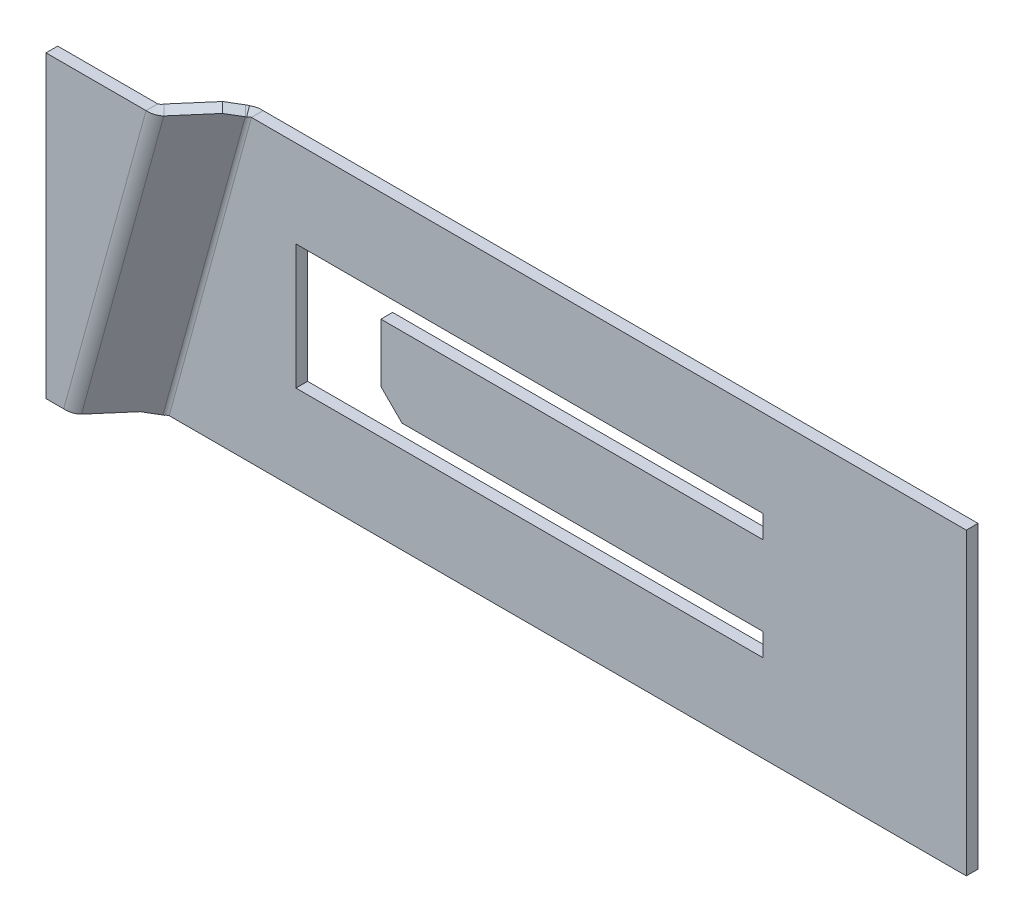
ISO-10303-21;
HEADER;
FILE_DESCRIPTION(('STEP AP214'),'2;1');
FILE_NAME('part.step','',(''),(''),'','','');
FILE_SCHEMA(('AUTOMOTIVE_DESIGN { 1 0 10303 214 1 1 1 1 }'));
ENDSEC;
DATA;
#1=APPLICATION_CONTEXT('core data for automotive mechanical design processes');
#2=APPLICATION_PROTOCOL_DEFINITION('international standard','automotive_design',2000,#1);
#3=PRODUCT_CONTEXT('',#1,'mechanical');
#4=PRODUCT('Part','Part','',(#3));
#5=PRODUCT_RELATED_PRODUCT_CATEGORY('part','',(#4));
#6=PRODUCT_DEFINITION_FORMATION('','',#4);
#7=PRODUCT_DEFINITION_CONTEXT('part definition',#1,'design');
#8=PRODUCT_DEFINITION('design','',#6,#7);
#9=PRODUCT_DEFINITION_SHAPE('','',#8);
#10=(LENGTH_UNIT() NAMED_UNIT(*) SI_UNIT(.MILLI.,.METRE.));
#11=(NAMED_UNIT(*) PLANE_ANGLE_UNIT() SI_UNIT($,.RADIAN.));
#12=(NAMED_UNIT(*) SI_UNIT($,.STERADIAN.) SOLID_ANGLE_UNIT());
#13=UNCERTAINTY_MEASURE_WITH_UNIT(LENGTH_MEASURE(1.E-05),#10,'distance_accuracy_value','');
#14=(GEOMETRIC_REPRESENTATION_CONTEXT(3) GLOBAL_UNCERTAINTY_ASSIGNED_CONTEXT((#13)) GLOBAL_UNIT_ASSIGNED_CONTEXT((#10,
#11,#12)) REPRESENTATION_CONTEXT('',''));
#15=CARTESIAN_POINT('',(0.,0.,0.));
#16=DIRECTION('',(0.,0.,1.));
#17=DIRECTION('',(1.,0.,0.));
#18=AXIS2_PLACEMENT_3D('',#15,#16,#17);
#19=CARTESIAN_POINT('',(-15.8319944409762,4.35148385219812,-39.4314969032034));
#20=DIRECTION('',(0.681821650518711,-0.187401272364792,0.707106781186546));
#21=DIRECTION('',(0.727679153852967,0.0748484197012313,-0.681821650518711));
#22=AXIS2_PLACEMENT_3D('',#19,#20,#21);
#23=PLANE('',#22);
#24=DIRECTION('',(0.727679153852967,0.0748484197012313,-0.681821650518711));
#25=VECTOR('',#24,1.);
#26=CARTESIAN_POINT('',(34.4230266717047,-14.5369228973472,-92.8953780390508));
#27=LINE('',#26,#25);
#28=CARTESIAN_POINT('',(-70.8111979487722,-25.3612200750545,5.70710678118654));
#29=VERTEX_POINT('',#28);
#30=CARTESIAN_POINT('',(-65.6467112000454,-24.8300056384949,0.868080047420297));
#31=VERTEX_POINT('',#30);
#32=EDGE_CURVE('E724',#29,#31,#27,.T.);
#33=ORIENTED_EDGE('',*,*,#32,.F.);
#34=DIRECTION('',(0.265025420984262,0.964241425283168,0.));
#35=VECTOR('',#34,1.);
#36=CARTESIAN_POINT('',(-59.3565059929042,16.3143612962953,5.70710678118655));
#37=LINE('',#36,#35);
#38=CARTESIAN_POINT('',(-56.7441145716668,25.8190194459036,5.70710678118655));
#39=VERTEX_POINT('',#38);
#40=EDGE_CURVE('E719',#29,#39,#37,.T.);
#41=ORIENTED_EDGE('',*,*,#40,.T.);
#42=DIRECTION('',(-0.727679153852967,-0.0748484197012313,0.681821650518711));
#43=VECTOR('',#42,1.);
#44=CARTESIAN_POINT('',(38.2537867197789,35.5904176630291,-83.3041360328885));
#45=LINE('',#44,#43);
#46=CARTESIAN_POINT('',(-51.57962782294,26.3502338824632,0.868080047420297));
#47=VERTEX_POINT('',#46);
#48=EDGE_CURVE('E730',#47,#39,#45,.T.);
#49=ORIENTED_EDGE('',*,*,#48,.F.);
#50=DIRECTION('',(0.681821650518708,-0.187401272364791,-0.707106781186549));
#51=VECTOR('',#50,1.);
#52=CARTESIAN_POINT('',(-51.57962782294,26.3502338824632,0.868080047420297));
#53=LINE('',#52,#51);
#54=CARTESIAN_POINT('',(-49.6613655544826,25.8229922063375,-1.12132034355962));
#55=VERTEX_POINT('',#54);
#56=EDGE_CURVE('E723',#47,#55,#53,.T.);
#57=ORIENTED_EDGE('',*,*,#56,.T.);
#58=DIRECTION('',(0.265025420984262,0.964241425283168,0.));
#59=VECTOR('',#58,1.);
#60=CARTESIAN_POINT('',(-52.7722536896967,14.5046545228991,-1.12132034355963));
#61=LINE('',#60,#59);
#62=CARTESIAN_POINT('',(-63.7284489315881,-25.3572473146206,-1.12132034355964));
#63=VERTEX_POINT('',#62);
#64=EDGE_CURVE('E706',#63,#55,#61,.T.);
#65=ORIENTED_EDGE('',*,*,#64,.F.);
#66=DIRECTION('',(0.681821650518708,-0.187401272364791,-0.707106781186549));
#67=VECTOR('',#66,1.);
#68=CARTESIAN_POINT('',(-65.6467112000454,-24.8300056384949,0.868080047420297));
#69=LINE('',#68,#67);
#70=EDGE_CURVE('E720',#31,#63,#69,.T.);
#71=ORIENTED_EDGE('',*,*,#70,.F.);
#72=EDGE_LOOP('',(#33,#41,#49,#57,#65,#71));
#73=FACE_BOUND('',#72,.T.);
#74=ADVANCED_FACE('F95',(#73),#23,.F.);
#75=CARTESIAN_POINT('',(-14.4683511399387,3.97668130746853,-38.0172833408303));
#76=DIRECTION('',(0.681821650518711,-0.187401272364792,0.707106781186546));
#77=DIRECTION('',(0.727679153852967,0.0748484197012313,-0.681821650518711));
#78=AXIS2_PLACEMENT_3D('',#75,#76,#77);
#79=PLANE('',#78);
#80=DIRECTION('',(0.265025420984262,0.964241425283168,0.));
#81=VECTOR('',#80,1.);
#82=CARTESIAN_POINT('',(-57.9928626918667,15.9395587515657,7.12132034355964));
#83=LINE('',#82,#81);
#84=CARTESIAN_POINT('',(-69.4475546477348,-25.7360226197841,7.12132034355963));
#85=VERTEX_POINT('',#84);
#86=CARTESIAN_POINT('',(-55.3804712706294,25.444216901174,7.12132034355964));
#87=VERTEX_POINT('',#86);
#88=EDGE_CURVE('E107',#85,#87,#83,.T.);
#89=ORIENTED_EDGE('',*,*,#88,.F.);
#90=DIRECTION('',(0.727679153852967,0.0748484197012313,-0.681821650518711));
#91=VECTOR('',#90,1.);
#92=CARTESIAN_POINT('',(35.7866699727421,-14.9117254420768,-91.4811644766777));
#93=LINE('',#92,#91);
#94=CARTESIAN_POINT('',(-64.283067899008,-25.2048081832245,2.28229360979339));
#95=VERTEX_POINT('',#94);
#96=EDGE_CURVE('E122',#85,#95,#93,.T.);
#97=ORIENTED_EDGE('',*,*,#96,.T.);
#98=DIRECTION('',(0.681821650518708,-0.187401272364791,-0.707106781186549));
#99=VECTOR('',#98,1.);
#100=CARTESIAN_POINT('',(-64.283067899008,-25.2048081832245,2.28229360979339));
#101=LINE('',#100,#99);
#102=CARTESIAN_POINT('',(-62.3648056305506,-25.7320498593502,0.292893218813449));
#103=VERTEX_POINT('',#102);
#104=EDGE_CURVE('E710',#95,#103,#101,.T.);
#105=ORIENTED_EDGE('',*,*,#104,.T.);
#106=DIRECTION('',(0.265025420984262,0.964241425283168,0.));
#107=VECTOR('',#106,1.);
#108=CARTESIAN_POINT('',(-51.4086103886593,14.1298519781695,0.292893218813456));
#109=LINE('',#108,#107);
#110=CARTESIAN_POINT('',(-48.2977222534452,25.4481896616079,0.292893218813449));
#111=VERTEX_POINT('',#110);
#112=EDGE_CURVE('E713',#103,#111,#109,.T.);
#113=ORIENTED_EDGE('',*,*,#112,.T.);
#114=DIRECTION('',(0.681821650518708,-0.187401272364791,-0.707106781186549));
#115=VECTOR('',#114,1.);
#116=CARTESIAN_POINT('',(-50.2159845219026,25.9754313377336,2.28229360979339));
#117=LINE('',#116,#115);
#118=CARTESIAN_POINT('',(-50.2159845219026,25.9754313377336,2.28229360979339));
#119=VERTEX_POINT('',#118);
#120=EDGE_CURVE('E726',#119,#111,#117,.T.);
#121=ORIENTED_EDGE('',*,*,#120,.F.);
#122=DIRECTION('',(-0.727679153852967,-0.0748484197012313,0.681821650518711));
#123=VECTOR('',#122,1.);
#124=CARTESIAN_POINT('',(39.6174300208163,35.2156151182995,-81.8899224705154));
#125=LINE('',#124,#123);
#126=EDGE_CURVE('E114',#119,#87,#125,.T.);
#127=ORIENTED_EDGE('',*,*,#126,.T.);
#128=EDGE_LOOP('',(#89,#97,#105,#113,#121,#127));
#129=FACE_BOUND('',#128,.T.);
#130=ADVANCED_FACE('F772',(#129),#79,.T.);
#131=CARTESIAN_POINT('',(-65.6467112000454,-24.8300056384949,0.868080047420297));
#132=DIRECTION('',(0.265025420984262,0.964241425283168,0.));
#133=DIRECTION('',(-0.681821650518708,0.187401272364791,0.707106781186549));
#134=AXIS2_PLACEMENT_3D('',#131,#132,#133);
#135=PLANE('',#134);
#136=DIRECTION('',(-0.681821650518712,0.187401272364792,-0.707106781186545));
#137=VECTOR('',#136,1.);
#138=CARTESIAN_POINT('',(-63.7284489315881,-25.3572473146206,-1.12132034355965));
#139=LINE('',#138,#137);
#140=EDGE_CURVE('E716',#103,#63,#139,.T.);
#141=ORIENTED_EDGE('',*,*,#140,.F.);
#142=ORIENTED_EDGE('',*,*,#104,.F.);
#143=DIRECTION('',(-0.681821650518711,0.187401272364792,-0.707106781186546));
#144=VECTOR('',#143,1.);
#145=CARTESIAN_POINT('',(-64.2830541943928,-25.2048119499901,2.28230782263969));
#146=LINE('',#145,#144);
#147=EDGE_CURVE('E702',#95,#31,#146,.T.);
#148=ORIENTED_EDGE('',*,*,#147,.T.);
#149=ORIENTED_EDGE('',*,*,#70,.T.);
#150=EDGE_LOOP('',(#141,#142,#148,#149));
#151=FACE_BOUND('',#150,.T.);
#152=ADVANCED_FACE('F774',(#151),#135,.F.);
#153=CARTESIAN_POINT('',(-51.57962782294,26.3502338824632,0.868080047420304));
#154=DIRECTION('',(-0.265025420984262,-0.964241425283168,0.));
#155=DIRECTION('',(0.681821650518708,-0.187401272364791,-0.707106781186549));
#156=AXIS2_PLACEMENT_3D('',#153,#154,#155);
#157=PLANE('',#156);
#158=DIRECTION('',(0.681821650518712,-0.187401272364792,0.707106781186545));
#159=VECTOR('',#158,1.);
#160=CARTESIAN_POINT('',(-49.6613655544826,25.8229922063375,-1.12132034355965));
#161=LINE('',#160,#159);
#162=EDGE_CURVE('E709',#55,#111,#161,.T.);
#163=ORIENTED_EDGE('',*,*,#162,.F.);
#164=ORIENTED_EDGE('',*,*,#56,.F.);
#165=DIRECTION('',(-0.681821650518711,0.187401272364792,-0.707106781186546));
#166=VECTOR('',#165,1.);
#167=CARTESIAN_POINT('',(-50.2159708172874,25.975427570968,2.28230782263969));
#168=LINE('',#167,#166);
#169=EDGE_CURVE('E560',#119,#47,#168,.T.);
#170=ORIENTED_EDGE('',*,*,#169,.F.);
#171=ORIENTED_EDGE('',*,*,#120,.T.);
#172=EDGE_LOOP('',(#163,#164,#170,#171));
#173=FACE_BOUND('',#172,.T.);
#174=ADVANCED_FACE('F686',(#173),#157,.F.);
#175=CARTESIAN_POINT('',(38.2537867197789,35.5904176630291,-83.3041360328885));
#176=DIRECTION('',(0.0748484197012314,0.97942762733358,0.187401272364792));
#177=DIRECTION('',(0.681821650518711,-0.187401272364792,0.707106781186546));
#178=AXIS2_PLACEMENT_3D('',#175,#176,#177);
#179=PLANE('',#178);
#180=CARTESIAN_POINT('',(-55.3804712706294,25.444216901174,7.12132034355966));
#181=CARTESIAN_POINT('',(-56.7441145716668,25.8190194459036,5.70710678118655));
#182=B_SPLINE_CURVE_WITH_KNOTS('',1,(#180,#181),.UNSPECIFIED.,.F.,.F.,(2,2),(0.,1.),.UNSPECIFIED.);
#183=EDGE_CURVE('E12',#87,#39,#182,.T.);
#184=ORIENTED_EDGE('',*,*,#183,.F.);
#185=ORIENTED_EDGE('',*,*,#126,.F.);
#186=ORIENTED_EDGE('',*,*,#169,.T.);
#187=ORIENTED_EDGE('',*,*,#48,.T.);
#188=EDGE_LOOP('',(#184,#185,#186,#187));
#189=FACE_BOUND('',#188,.T.);
#190=ADVANCED_FACE('F97',(#189),#179,.T.);
#191=CARTESIAN_POINT('',(34.4230266717047,-14.5369228973472,-92.8953780390508));
#192=DIRECTION('',(-0.0748484197012314,-0.97942762733358,-0.187401272364792));
#193=DIRECTION('',(-0.681821650518711,0.187401272364792,-0.707106781186546));
#194=AXIS2_PLACEMENT_3D('',#191,#192,#193);
#195=PLANE('',#194);
#196=CARTESIAN_POINT('',(-70.8111979487722,-25.3612200750545,5.70710678118655));
#197=CARTESIAN_POINT('',(-69.4475546477348,-25.7360226197841,7.12132034355965));
#198=B_SPLINE_CURVE_WITH_KNOTS('',1,(#196,#197),.UNSPECIFIED.,.F.,.F.,(2,2),(0.,1.),.UNSPECIFIED.);
#199=EDGE_CURVE('E402',#29,#85,#198,.T.);
#200=ORIENTED_EDGE('',*,*,#199,.F.);
#201=ORIENTED_EDGE('',*,*,#32,.T.);
#202=ORIENTED_EDGE('',*,*,#147,.F.);
#203=ORIENTED_EDGE('',*,*,#96,.F.);
#204=EDGE_LOOP('',(#200,#201,#202,#203));
#205=FACE_BOUND('',#204,.T.);
#206=ADVANCED_FACE('F763',(#205),#195,.T.);
#207=CARTESIAN_POINT('',(74.6378493013972,-25.590119760479,-2.));
#208=DIRECTION('',(1.,0.,0.));
#209=DIRECTION('',(0.,0.,-1.));
#210=AXIS2_PLACEMENT_3D('',#207,#208,#209);
#211=PLANE('',#210);
#212=DIRECTION('',(0.,1.,0.));
#213=VECTOR('',#212,1.);
#214=CARTESIAN_POINT('',(74.6378493013972,-25.590119760479,0.));
#215=LINE('',#214,#213);
#216=CARTESIAN_POINT('',(74.6378493013972,-25.590119760479,0.));
#217=VERTEX_POINT('',#216);
#218=CARTESIAN_POINT('',(74.6378493013972,25.590119760479,0.));
#219=VERTEX_POINT('',#218);
#220=EDGE_CURVE('E562',#217,#219,#215,.T.);
#221=ORIENTED_EDGE('',*,*,#220,.F.);
#222=DIRECTION('',(0.,0.,1.));
#223=VECTOR('',#222,1.);
#224=CARTESIAN_POINT('',(74.6378493013972,-25.590119760479,-2.));
#225=LINE('',#224,#223);
#226=CARTESIAN_POINT('',(74.6378493013972,-25.590119760479,-2.));
#227=VERTEX_POINT('',#226);
#228=EDGE_CURVE('E552',#227,#217,#225,.T.);
#229=ORIENTED_EDGE('',*,*,#228,.F.);
#230=DIRECTION('',(0.,1.,0.));
#231=VECTOR('',#230,1.);
#232=CARTESIAN_POINT('',(74.6378493013972,-25.590119760479,-2.));
#233=LINE('',#232,#231);
#234=CARTESIAN_POINT('',(74.6378493013972,25.590119760479,-2.));
#235=VERTEX_POINT('',#234);
#236=EDGE_CURVE('E642',#227,#235,#233,.T.);
#237=ORIENTED_EDGE('',*,*,#236,.T.);
#238=DIRECTION('',(0.,0.,1.));
#239=VECTOR('',#238,1.);
#240=CARTESIAN_POINT('',(74.6378493013972,25.590119760479,-2.));
#241=LINE('',#240,#239);
#242=EDGE_CURVE('E640',#235,#219,#241,.T.);
#243=ORIENTED_EDGE('',*,*,#242,.T.);
#244=EDGE_LOOP('',(#221,#229,#237,#243));
#245=FACE_BOUND('',#244,.T.);
#246=ADVANCED_FACE('F508',(#245),#211,.T.);
#247=CARTESIAN_POINT('',(-21.7954273015734,-6.79196508268893,-2.));
#248=DIRECTION('',(0.707106781186537,0.707106781186558,0.));
#249=DIRECTION('',(-0.707106781186558,0.707106781186537,0.));
#250=AXIS2_PLACEMENT_3D('',#247,#248,#249);
#251=PLANE('',#250);
#252=DIRECTION('',(-0.707106781186558,0.707106781186537,0.));
#253=VECTOR('',#252,1.);
#254=CARTESIAN_POINT('',(-21.7954273015734,-6.79196508268893,0.));
#255=LINE('',#254,#253);
#256=CARTESIAN_POINT('',(-21.7954273015734,-6.79196508268893,0.));
#257=VERTEX_POINT('',#256);
#258=CARTESIAN_POINT('',(-25.4100806282466,-3.17731175601577,0.));
#259=VERTEX_POINT('',#258);
#260=EDGE_CURVE('E637',#257,#259,#255,.T.);
#261=ORIENTED_EDGE('',*,*,#260,.T.);
#262=DIRECTION('',(0.,0.,1.));
#263=VECTOR('',#262,1.);
#264=CARTESIAN_POINT('',(-25.4100806282466,-3.17731175601577,-2.));
#265=LINE('',#264,#263);
#266=CARTESIAN_POINT('',(-25.4100806282466,-3.17731175601577,-2.));
#267=VERTEX_POINT('',#266);
#268=EDGE_CURVE('E595',#267,#259,#265,.T.);
#269=ORIENTED_EDGE('',*,*,#268,.F.);
#270=DIRECTION('',(-0.707106781186558,0.707106781186537,0.));
#271=VECTOR('',#270,1.);
#272=CARTESIAN_POINT('',(-21.7954273015734,-6.79196508268893,-2.));
#273=LINE('',#272,#271);
#274=CARTESIAN_POINT('',(-21.7954273015734,-6.79196508268893,-2.));
#275=VERTEX_POINT('',#274);
#276=EDGE_CURVE('E567',#275,#267,#273,.T.);
#277=ORIENTED_EDGE('',*,*,#276,.F.);
#278=DIRECTION('',(0.,0.,1.));
#279=VECTOR('',#278,1.);
#280=CARTESIAN_POINT('',(-21.7954273015734,-6.79196508268893,-2.));
#281=LINE('',#280,#279);
#282=EDGE_CURVE('E635',#275,#257,#281,.T.);
#283=ORIENTED_EDGE('',*,*,#282,.T.);
#284=EDGE_LOOP('',(#261,#269,#277,#283));
#285=FACE_BOUND('',#284,.T.);
#286=ADVANCED_FACE('F1037',(#285),#251,.F.);
#287=CARTESIAN_POINT('',(39.9264512287923,-6.79196508268892,-2.));
#288=DIRECTION('',(0.,1.,0.));
#289=DIRECTION('',(-1.,0.,0.));
#290=AXIS2_PLACEMENT_3D('',#287,#288,#289);
#291=PLANE('',#290);
#292=DIRECTION('',(-1.,0.,0.));
#293=VECTOR('',#292,1.);
#294=CARTESIAN_POINT('',(39.9264512287923,-6.79196508268892,0.));
#295=LINE('',#294,#293);
#296=CARTESIAN_POINT('',(39.9264512287923,-6.79196508268892,0.));
#297=VERTEX_POINT('',#296);
#298=EDGE_CURVE('E632',#297,#257,#295,.T.);
#299=ORIENTED_EDGE('',*,*,#298,.T.);
#300=ORIENTED_EDGE('',*,*,#282,.F.);
#301=DIRECTION('',(-1.,0.,0.));
#302=VECTOR('',#301,1.);
#303=CARTESIAN_POINT('',(39.9264512287923,-6.79196508268892,-2.));
#304=LINE('',#303,#302);
#305=CARTESIAN_POINT('',(39.9264512287923,-6.79196508268892,-2.));
#306=VERTEX_POINT('',#305);
#307=EDGE_CURVE('E571',#306,#275,#304,.T.);
#308=ORIENTED_EDGE('',*,*,#307,.F.);
#309=DIRECTION('',(0.,0.,1.));
#310=VECTOR('',#309,1.);
#311=CARTESIAN_POINT('',(39.9264512287923,-6.79196508268892,-2.));
#312=LINE('',#311,#310);
#313=EDGE_CURVE('E630',#306,#297,#312,.T.);
#314=ORIENTED_EDGE('',*,*,#313,.T.);
#315=EDGE_LOOP('',(#299,#300,#308,#314));
#316=FACE_BOUND('',#315,.T.);
#317=ADVANCED_FACE('F1027',(#316),#291,.F.);
#318=CARTESIAN_POINT('',(39.9264512287924,-10.6721055548399,-2.));
#319=DIRECTION('',(1.,0.,0.));
#320=DIRECTION('',(0.,1.,0.));
#321=AXIS2_PLACEMENT_3D('',#318,#319,#320);
#322=PLANE('',#321);
#323=DIRECTION('',(0.,1.,0.));
#324=VECTOR('',#323,1.);
#325=CARTESIAN_POINT('',(39.9264512287924,-10.6721055548399,0.));
#326=LINE('',#325,#324);
#327=CARTESIAN_POINT('',(39.9264512287924,-10.6721055548399,0.));
#328=VERTEX_POINT('',#327);
#329=EDGE_CURVE('E627',#328,#297,#326,.T.);
#330=ORIENTED_EDGE('',*,*,#329,.T.);
#331=ORIENTED_EDGE('',*,*,#313,.F.);
#332=DIRECTION('',(0.,1.,0.));
#333=VECTOR('',#332,1.);
#334=CARTESIAN_POINT('',(39.9264512287924,-10.6721055548399,-2.));
#335=LINE('',#334,#333);
#336=CARTESIAN_POINT('',(39.9264512287924,-10.6721055548399,-2.));
#337=VERTEX_POINT('',#336);
#338=EDGE_CURVE('E574',#337,#306,#335,.T.);
#339=ORIENTED_EDGE('',*,*,#338,.F.);
#340=DIRECTION('',(0.,0.,1.));
#341=VECTOR('',#340,1.);
#342=CARTESIAN_POINT('',(39.9264512287924,-10.6721055548399,-2.));
#343=LINE('',#342,#341);
#344=EDGE_CURVE('E625',#337,#328,#343,.T.);
#345=ORIENTED_EDGE('',*,*,#344,.T.);
#346=EDGE_LOOP('',(#330,#331,#339,#345));
#347=FACE_BOUND('',#346,.T.);
#348=ADVANCED_FACE('F1017',(#347),#322,.F.);
#349=CARTESIAN_POINT('',(39.9264512287924,-10.6721055548399,-2.));
#350=DIRECTION('',(0.,-1.,0.));
#351=DIRECTION('',(0.,0.,-1.));
#352=AXIS2_PLACEMENT_3D('',#349,#350,#351);
#353=PLANE('',#352);
#354=DIRECTION('',(1.,0.,0.));
#355=VECTOR('',#354,1.);
#356=CARTESIAN_POINT('',(39.9264512287924,-10.6721055548399,0.));
#357=LINE('',#356,#355);
#358=CARTESIAN_POINT('',(-39.9264512287924,-10.6721055548399,0.));
#359=VERTEX_POINT('',#358);
#360=EDGE_CURVE('E622',#359,#328,#357,.T.);
#361=ORIENTED_EDGE('',*,*,#360,.T.);
#362=ORIENTED_EDGE('',*,*,#344,.F.);
#363=DIRECTION('',(1.,0.,0.));
#364=VECTOR('',#363,1.);
#365=CARTESIAN_POINT('',(39.9264512287924,-10.6721055548399,-2.));
#366=LINE('',#365,#364);
#367=CARTESIAN_POINT('',(-39.9264512287924,-10.6721055548399,-2.));
#368=VERTEX_POINT('',#367);
#369=EDGE_CURVE('E577',#368,#337,#366,.T.);
#370=ORIENTED_EDGE('',*,*,#369,.F.);
#371=DIRECTION('',(0.,0.,1.));
#372=VECTOR('',#371,1.);
#373=CARTESIAN_POINT('',(-39.9264512287924,-10.6721055548399,-2.));
#374=LINE('',#373,#372);
#375=EDGE_CURVE('E620',#368,#359,#374,.T.);
#376=ORIENTED_EDGE('',*,*,#375,.T.);
#377=EDGE_LOOP('',(#361,#362,#370,#376));
#378=FACE_BOUND('',#377,.T.);
#379=ADVANCED_FACE('F1007',(#378),#353,.F.);
#380=CARTESIAN_POINT('',(-39.9264512287924,-10.6721055548399,-2.));
#381=DIRECTION('',(-1.,0.,0.));
#382=DIRECTION('',(0.,0.,1.));
#383=AXIS2_PLACEMENT_3D('',#380,#381,#382);
#384=PLANE('',#383);
#385=DIRECTION('',(0.,-1.,0.));
#386=VECTOR('',#385,1.);
#387=CARTESIAN_POINT('',(-39.9264512287924,-10.6721055548399,0.));
#388=LINE('',#387,#386);
#389=CARTESIAN_POINT('',(-39.9264512287924,10.6721055548399,0.));
#390=VERTEX_POINT('',#389);
#391=EDGE_CURVE('E617',#390,#359,#388,.T.);
#392=ORIENTED_EDGE('',*,*,#391,.T.);
#393=ORIENTED_EDGE('',*,*,#375,.F.);
#394=DIRECTION('',(0.,-1.,0.));
#395=VECTOR('',#394,1.);
#396=CARTESIAN_POINT('',(-39.9264512287924,-10.6721055548399,-2.));
#397=LINE('',#396,#395);
#398=CARTESIAN_POINT('',(-39.9264512287924,10.6721055548399,-2.));
#399=VERTEX_POINT('',#398);
#400=EDGE_CURVE('E580',#399,#368,#397,.T.);
#401=ORIENTED_EDGE('',*,*,#400,.F.);
#402=DIRECTION('',(0.,0.,1.));
#403=VECTOR('',#402,1.);
#404=CARTESIAN_POINT('',(-39.9264512287924,10.6721055548399,-2.));
#405=LINE('',#404,#403);
#406=EDGE_CURVE('E615',#399,#390,#405,.T.);
#407=ORIENTED_EDGE('',*,*,#406,.T.);
#408=EDGE_LOOP('',(#392,#393,#401,#407));
#409=FACE_BOUND('',#408,.T.);
#410=ADVANCED_FACE('F997',(#409),#384,.F.);
#411=CARTESIAN_POINT('',(39.9264512287924,10.6721055548399,-2.));
#412=DIRECTION('',(0.,1.,0.));
#413=DIRECTION('',(0.,0.,1.));
#414=AXIS2_PLACEMENT_3D('',#411,#412,#413);
#415=PLANE('',#414);
#416=DIRECTION('',(-1.,0.,0.));
#417=VECTOR('',#416,1.);
#418=CARTESIAN_POINT('',(39.9264512287924,10.6721055548399,0.));
#419=LINE('',#418,#417);
#420=CARTESIAN_POINT('',(39.9264512287924,10.6721055548399,0.));
#421=VERTEX_POINT('',#420);
#422=EDGE_CURVE('E612',#421,#390,#419,.T.);
#423=ORIENTED_EDGE('',*,*,#422,.T.);
#424=ORIENTED_EDGE('',*,*,#406,.F.);
#425=DIRECTION('',(-1.,0.,0.));
#426=VECTOR('',#425,1.);
#427=CARTESIAN_POINT('',(39.9264512287924,10.6721055548399,-2.));
#428=LINE('',#427,#426);
#429=CARTESIAN_POINT('',(39.9264512287924,10.6721055548399,-2.));
#430=VERTEX_POINT('',#429);
#431=EDGE_CURVE('E583',#430,#399,#428,.T.);
#432=ORIENTED_EDGE('',*,*,#431,.F.);
#433=DIRECTION('',(0.,0.,1.));
#434=VECTOR('',#433,1.);
#435=CARTESIAN_POINT('',(39.9264512287924,10.6721055548399,-2.));
#436=LINE('',#435,#434);
#437=EDGE_CURVE('E610',#430,#421,#436,.T.);
#438=ORIENTED_EDGE('',*,*,#437,.T.);
#439=EDGE_LOOP('',(#423,#424,#432,#438));
#440=FACE_BOUND('',#439,.T.);
#441=ADVANCED_FACE('F987',(#440),#415,.F.);
#442=CARTESIAN_POINT('',(39.9264512287923,6.79196508268892,-2.));
#443=DIRECTION('',(1.,0.,0.));
#444=DIRECTION('',(0.,1.,0.));
#445=AXIS2_PLACEMENT_3D('',#442,#443,#444);
#446=PLANE('',#445);
#447=DIRECTION('',(0.,1.,0.));
#448=VECTOR('',#447,1.);
#449=CARTESIAN_POINT('',(39.9264512287923,6.79196508268892,0.));
#450=LINE('',#449,#448);
#451=CARTESIAN_POINT('',(39.9264512287923,6.79196508268892,0.));
#452=VERTEX_POINT('',#451);
#453=EDGE_CURVE('E607',#452,#421,#450,.T.);
#454=ORIENTED_EDGE('',*,*,#453,.T.);
#455=ORIENTED_EDGE('',*,*,#437,.F.);
#456=DIRECTION('',(0.,1.,0.));
#457=VECTOR('',#456,1.);
#458=CARTESIAN_POINT('',(39.9264512287923,6.79196508268892,-2.));
#459=LINE('',#458,#457);
#460=CARTESIAN_POINT('',(39.9264512287923,6.79196508268892,-2.));
#461=VERTEX_POINT('',#460);
#462=EDGE_CURVE('E586',#461,#430,#459,.T.);
#463=ORIENTED_EDGE('',*,*,#462,.F.);
#464=DIRECTION('',(0.,0.,1.));
#465=VECTOR('',#464,1.);
#466=CARTESIAN_POINT('',(39.9264512287923,6.79196508268892,-2.));
#467=LINE('',#466,#465);
#468=EDGE_CURVE('E604',#461,#452,#467,.T.);
#469=ORIENTED_EDGE('',*,*,#468,.T.);
#470=EDGE_LOOP('',(#454,#455,#463,#469));
#471=FACE_BOUND('',#470,.T.);
#472=ADVANCED_FACE('F977',(#471),#446,.F.);
#473=CARTESIAN_POINT('',(39.9264512287923,6.79196508268892,-2.));
#474=DIRECTION('',(0.,-1.,0.));
#475=DIRECTION('',(1.,0.,0.));
#476=AXIS2_PLACEMENT_3D('',#473,#474,#475);
#477=PLANE('',#476);
#478=DIRECTION('',(1.,0.,0.));
#479=VECTOR('',#478,1.);
#480=CARTESIAN_POINT('',(39.9264512287923,6.79196508268892,0.));
#481=LINE('',#480,#479);
#482=CARTESIAN_POINT('',(-25.4100806282466,6.79196508268889,0.));
#483=VERTEX_POINT('',#482);
#484=EDGE_CURVE('E602',#483,#452,#481,.T.);
#485=ORIENTED_EDGE('',*,*,#484,.T.);
#486=ORIENTED_EDGE('',*,*,#468,.F.);
#487=DIRECTION('',(1.,0.,0.));
#488=VECTOR('',#487,1.);
#489=CARTESIAN_POINT('',(39.9264512287923,6.79196508268892,-2.));
#490=LINE('',#489,#488);
#491=CARTESIAN_POINT('',(-25.4100806282466,6.79196508268889,-2.));
#492=VERTEX_POINT('',#491);
#493=EDGE_CURVE('E589',#492,#461,#490,.T.);
#494=ORIENTED_EDGE('',*,*,#493,.F.);
#495=DIRECTION('',(0.,0.,1.));
#496=VECTOR('',#495,1.);
#497=CARTESIAN_POINT('',(-25.4100806282466,6.79196508268889,-2.));
#498=LINE('',#497,#496);
#499=EDGE_CURVE('E600',#492,#483,#498,.T.);
#500=ORIENTED_EDGE('',*,*,#499,.T.);
#501=EDGE_LOOP('',(#485,#486,#494,#500));
#502=FACE_BOUND('',#501,.T.);
#503=ADVANCED_FACE('F969',(#502),#477,.F.);
#504=CARTESIAN_POINT('',(-25.4100806282466,6.79196508268889,-2.));
#505=DIRECTION('',(1.,0.,0.));
#506=DIRECTION('',(0.,0.,-1.));
#507=AXIS2_PLACEMENT_3D('',#504,#505,#506);
#508=PLANE('',#507);
#509=DIRECTION('',(0.,1.,0.));
#510=VECTOR('',#509,1.);
#511=CARTESIAN_POINT('',(-25.4100806282466,6.79196508268889,0.));
#512=LINE('',#511,#510);
#513=EDGE_CURVE('E597',#259,#483,#512,.T.);
#514=ORIENTED_EDGE('',*,*,#513,.T.);
#515=ORIENTED_EDGE('',*,*,#499,.F.);
#516=DIRECTION('',(0.,1.,0.));
#517=VECTOR('',#516,1.);
#518=CARTESIAN_POINT('',(-25.4100806282466,6.79196508268889,-2.));
#519=LINE('',#518,#517);
#520=EDGE_CURVE('E592',#267,#492,#519,.T.);
#521=ORIENTED_EDGE('',*,*,#520,.F.);
#522=ORIENTED_EDGE('',*,*,#268,.T.);
#523=EDGE_LOOP('',(#514,#515,#521,#522));
#524=FACE_BOUND('',#523,.T.);
#525=ADVANCED_FACE('F959',(#524),#508,.F.);
#526=CARTESIAN_POINT('',(0.,0.,-2.));
#527=DIRECTION('',(0.,0.,1.));
#528=DIRECTION('',(1.,0.,0.));
#529=AXIS2_PLACEMENT_3D('',#526,#527,#528);
#530=PLANE('',#529);
#531=ORIENTED_EDGE('',*,*,#520,.T.);
#532=ORIENTED_EDGE('',*,*,#493,.T.);
#533=ORIENTED_EDGE('',*,*,#462,.T.);
#534=ORIENTED_EDGE('',*,*,#431,.T.);
#535=ORIENTED_EDGE('',*,*,#400,.T.);
#536=ORIENTED_EDGE('',*,*,#369,.T.);
#537=ORIENTED_EDGE('',*,*,#338,.T.);
#538=ORIENTED_EDGE('',*,*,#307,.T.);
#539=ORIENTED_EDGE('',*,*,#276,.T.);
#540=EDGE_LOOP('',(#531,#532,#533,#534,#535,#536,#537,#538,#539));
#541=FACE_BOUND('',#540,.T.);
#542=DIRECTION('',(1.,0.,0.));
#543=VECTOR('',#542,1.);
#544=CARTESIAN_POINT('',(74.6378493013972,-25.590119760479,-2.));
#545=LINE('',#544,#543);
#546=CARTESIAN_POINT('',(-61.5924660008033,-25.590119760479,-2.));
#547=VERTEX_POINT('',#546);
#548=EDGE_CURVE('E561',#547,#227,#545,.T.);
#549=ORIENTED_EDGE('',*,*,#548,.F.);
#550=DIRECTION('',(0.265025420984262,0.964241425283168,0.));
#551=VECTOR('',#550,1.);
#552=CARTESIAN_POINT('',(-50.7267887381406,13.9424507058047,-2.));
#553=LINE('',#552,#551);
#554=CARTESIAN_POINT('',(-47.5253826236979,25.5901197604791,-2.));
#555=VERTEX_POINT('',#554);
#556=EDGE_CURVE('E570',#547,#555,#553,.T.);
#557=ORIENTED_EDGE('',*,*,#556,.T.);
#558=DIRECTION('',(-1.,0.,0.));
#559=VECTOR('',#558,1.);
#560=CARTESIAN_POINT('',(74.6378493013972,25.590119760479,-2.));
#561=LINE('',#560,#559);
#562=EDGE_CURVE('E646',#235,#555,#561,.T.);
#563=ORIENTED_EDGE('',*,*,#562,.F.);
#564=ORIENTED_EDGE('',*,*,#236,.F.);
#565=EDGE_LOOP('',(#549,#557,#563,#564));
#566=FACE_BOUND('',#565,.T.);
#567=ADVANCED_FACE('F676',(#541,#566),#530,.F.);
#568=CARTESIAN_POINT('',(74.6378493013972,25.590119760479,-2.));
#569=DIRECTION('',(0.,1.,0.));
#570=DIRECTION('',(0.,0.,1.));
#571=AXIS2_PLACEMENT_3D('',#568,#569,#570);
#572=PLANE('',#571);
#573=CARTESIAN_POINT('',(-47.5253826236979,25.5901197604791,0.));
#574=CARTESIAN_POINT('',(-47.5253826236979,25.5901197604791,-2.));
#575=B_SPLINE_CURVE_WITH_KNOTS('',1,(#573,#574),.UNSPECIFIED.,.F.,.F.,(2,2),(0.,1.),.UNSPECIFIED.);
#576=CARTESIAN_POINT('',(-47.5253826236979,25.5901197604791,0.));
#577=VERTEX_POINT('',#576);
#578=EDGE_CURVE('E645',#577,#555,#575,.T.);
#579=ORIENTED_EDGE('',*,*,#578,.F.);
#580=DIRECTION('',(-1.,0.,0.));
#581=VECTOR('',#580,1.);
#582=CARTESIAN_POINT('',(74.6378493013972,25.590119760479,0.));
#583=LINE('',#582,#581);
#584=EDGE_CURVE('E565',#219,#577,#583,.T.);
#585=ORIENTED_EDGE('',*,*,#584,.F.);
#586=ORIENTED_EDGE('',*,*,#242,.F.);
#587=ORIENTED_EDGE('',*,*,#562,.T.);
#588=EDGE_LOOP('',(#579,#585,#586,#587));
#589=FACE_BOUND('',#588,.T.);
#590=ADVANCED_FACE('F665',(#589),#572,.T.);
#591=CARTESIAN_POINT('',(0.,0.,0.));
#592=DIRECTION('',(0.,0.,1.));
#593=DIRECTION('',(1.,0.,0.));
#594=AXIS2_PLACEMENT_3D('',#591,#592,#593);
#595=PLANE('',#594);
#596=DIRECTION('',(0.265025420984262,0.964241425283168,0.));
#597=VECTOR('',#596,1.);
#598=CARTESIAN_POINT('',(-50.7267887381406,13.9424507058047,0.));
#599=LINE('',#598,#597);
#600=CARTESIAN_POINT('',(-61.5924660008033,-25.5901197604791,0.));
#601=VERTEX_POINT('',#600);
#602=EDGE_CURVE('E663',#601,#577,#599,.T.);
#603=ORIENTED_EDGE('',*,*,#602,.F.);
#604=DIRECTION('',(1.,0.,0.));
#605=VECTOR('',#604,1.);
#606=CARTESIAN_POINT('',(74.6378493013972,-25.590119760479,0.));
#607=LINE('',#606,#605);
#608=EDGE_CURVE('E566',#601,#217,#607,.T.);
#609=ORIENTED_EDGE('',*,*,#608,.T.);
#610=ORIENTED_EDGE('',*,*,#220,.T.);
#611=ORIENTED_EDGE('',*,*,#584,.T.);
#612=EDGE_LOOP('',(#603,#609,#610,#611));
#613=FACE_BOUND('',#612,.T.);
#614=ORIENTED_EDGE('',*,*,#484,.F.);
#615=ORIENTED_EDGE('',*,*,#513,.F.);
#616=ORIENTED_EDGE('',*,*,#260,.F.);
#617=ORIENTED_EDGE('',*,*,#298,.F.);
#618=ORIENTED_EDGE('',*,*,#329,.F.);
#619=ORIENTED_EDGE('',*,*,#360,.F.);
#620=ORIENTED_EDGE('',*,*,#391,.F.);
#621=ORIENTED_EDGE('',*,*,#422,.F.);
#622=ORIENTED_EDGE('',*,*,#453,.F.);
#623=EDGE_LOOP('',(#614,#615,#616,#617,#618,#619,#620,#621,#622));
#624=FACE_BOUND('',#623,.T.);
#625=ADVANCED_FACE('F675',(#613,#624),#595,.T.);
#626=CARTESIAN_POINT('',(74.6378493013972,-25.590119760479,-2.));
#627=DIRECTION('',(0.,-1.,0.));
#628=DIRECTION('',(0.,0.,-1.));
#629=AXIS2_PLACEMENT_3D('',#626,#627,#628);
#630=PLANE('',#629);
#631=CARTESIAN_POINT('',(-61.5924660008033,-25.5901197604791,-2.));
#632=CARTESIAN_POINT('',(-61.5924660008033,-25.5901197604791,0.));
#633=B_SPLINE_CURVE_WITH_KNOTS('',1,(#631,#632),.UNSPECIFIED.,.F.,.F.,(2,2),(0.,1.),.UNSPECIFIED.);
#634=EDGE_CURVE('E548',#547,#601,#633,.T.);
#635=ORIENTED_EDGE('',*,*,#634,.F.);
#636=ORIENTED_EDGE('',*,*,#548,.T.);
#637=ORIENTED_EDGE('',*,*,#228,.T.);
#638=ORIENTED_EDGE('',*,*,#608,.F.);
#639=EDGE_LOOP('',(#635,#636,#637,#638));
#640=FACE_BOUND('',#639,.T.);
#641=ADVANCED_FACE('F680',(#640),#630,.T.);
#642=CARTESIAN_POINT('',(-61.6829839800319,-25.919451131715,1.));
#643=DIRECTION('',(-0.265025420984216,-0.96424142528318,0.));
#644=DIRECTION('',(0.964241425283181,-0.265025420984216,0.));
#645=AXIS2_PLACEMENT_3D('',#642,#643,#644);
#646=PLANE('',#645);
#647=CARTESIAN_POINT('',(-62.2442778357596,-25.7651773818951,0.186889418566655));
#648=CARTESIAN_POINT('',(-63.366865547215,-25.4566298822553,-1.43933174430003));
#649=B_SPLINE_CURVE_WITH_KNOTS('',1,(#647,#648),.UNSPECIFIED.,.F.,.F.,(2,2),(0.,1.),.UNSPECIFIED.);
#650=CARTESIAN_POINT('',(-62.2442778357596,-25.7651773818951,0.186889418566656));
#651=VERTEX_POINT('',#650);
#652=CARTESIAN_POINT('',(-63.3668655472149,-25.4566298822553,-1.43933174430003));
#653=VERTEX_POINT('',#652);
#654=EDGE_CURVE('E537',#651,#653,#649,.T.);
#655=ORIENTED_EDGE('',*,*,#654,.F.);
#656=CARTESIAN_POINT('',(-61.6829839800319,-25.919451131715,1.));
#657=DIRECTION('',(0.265025420984262,0.964241425283168,0.));
#658=DIRECTION('',(-0.964241425283168,0.265025420984262,0.));
#659=AXIS2_PLACEMENT_3D('',#656,#657,#658);
#660=CIRCLE('',#659,1.);
#661=EDGE_CURVE('E804',#651,#103,#660,.T.);
#662=ORIENTED_EDGE('',*,*,#661,.T.);
#663=ORIENTED_EDGE('',*,*,#140,.T.);
#664=CARTESIAN_POINT('',(-61.6829839800319,-25.919451131715,1.));
#665=DIRECTION('',(0.265025420984216,0.96424142528318,0.));
#666=DIRECTION('',(0.964241425283181,-0.265025420984216,0.));
#667=AXIS2_PLACEMENT_3D('',#664,#665,#666);
#668=CIRCLE('',#667,3.);
#669=EDGE_CURVE('E440',#653,#63,#668,.T.);
#670=ORIENTED_EDGE('',*,*,#669,.F.);
#671=EDGE_LOOP('',(#655,#662,#663,#670));
#672=FACE_BOUND('',#671,.T.);
#673=ADVANCED_FACE('F506',(#672),#646,.T.);
#674=CARTESIAN_POINT('',(-47.6159006029265,25.2607883892431,1.));
#675=DIRECTION('',(0.26502542098405,0.964241425283226,2.15109044748682E-13));
#676=DIRECTION('',(-0.964241425283226,0.265025420984051,0.));
#677=AXIS2_PLACEMENT_3D('',#674,#675,#676);
#678=PLANE('',#677);
#679=ORIENTED_EDGE('',*,*,#162,.T.);
#680=CARTESIAN_POINT('',(-47.6159006029265,25.2607883892431,1.));
#681=DIRECTION('',(0.265025420984262,0.964241425283168,0.));
#682=DIRECTION('',(-0.964241425283168,0.265025420984262,0.));
#683=AXIS2_PLACEMENT_3D('',#680,#681,#682);
#684=CIRCLE('',#683,1.);
#685=CARTESIAN_POINT('',(-48.1771944586541,25.4150621390631,0.186889418566654));
#686=VERTEX_POINT('',#685);
#687=EDGE_CURVE('E454',#111,#686,#684,.F.);
#688=ORIENTED_EDGE('',*,*,#687,.T.);
#689=CARTESIAN_POINT('',(-49.2997821701095,25.7236096387028,-1.43933174430004));
#690=CARTESIAN_POINT('',(-48.1771944586542,25.415062139063,0.186889418566653));
#691=B_SPLINE_CURVE_WITH_KNOTS('',1,(#689,#690),.UNSPECIFIED.,.F.,.F.,(2,2),(0.,1.),.UNSPECIFIED.);
#692=CARTESIAN_POINT('',(-49.2997821701095,25.7236096387029,-1.43933174430004));
#693=VERTEX_POINT('',#692);
#694=EDGE_CURVE('E830',#686,#693,#691,.F.);
#695=ORIENTED_EDGE('',*,*,#694,.T.);
#696=CARTESIAN_POINT('',(-47.6159006029265,25.2607883892431,1.));
#697=DIRECTION('',(-0.26502542098405,-0.964241425283226,-2.15109044748682E-13));
#698=DIRECTION('',(0.964241425283226,-0.265025420984051,0.));
#699=AXIS2_PLACEMENT_3D('',#696,#697,#698);
#700=CIRCLE('',#699,3.);
#701=EDGE_CURVE('E438',#55,#693,#700,.T.);
#702=ORIENTED_EDGE('',*,*,#701,.F.);
#703=EDGE_LOOP('',(#679,#688,#695,#702));
#704=FACE_BOUND('',#703,.T.);
#705=ADVANCED_FACE('F851',(#704),#678,.T.);
#706=CARTESIAN_POINT('',(-49.2997821701095,25.7236096387028,-1.43933174430004));
#707=CARTESIAN_POINT('',(-48.7810224452319,25.6994277489598,-1.80202199051638));
#708=CARTESIAN_POINT('',(-48.1564222110496,25.6451621972178,-2.));
#709=CARTESIAN_POINT('',(-47.5253826236979,25.5901197604791,-2.));
#710=CARTESIAN_POINT('',(-48.1771944586542,25.415062139063,0.186889418566653));
#711=CARTESIAN_POINT('',(-47.9841807548187,25.4803651357004,0.0660413197814174));
#712=CARTESIAN_POINT('',(-47.7558078875447,25.5350994733185,0.));
#713=CARTESIAN_POINT('',(-47.5253826236979,25.5901197604791,0.));
#714=B_SPLINE_SURFACE_WITH_KNOTS('',1,3,((#706,#707,#708,#709),(#710,#711,#712,#713)),
.UNSPECIFIED.,.F.,.F.,.F.,(2,2),(4,4),(0.,1.),(0.,1.),.UNSPECIFIED.);
#715=CARTESIAN_POINT('',(-48.1771944586542,25.415062139063,0.186889418566653));
#716=CARTESIAN_POINT('',(-47.9841807548187,25.4803651357004,0.0660413197814174));
#717=CARTESIAN_POINT('',(-47.7558078875447,25.5350994733185,0.));
#718=CARTESIAN_POINT('',(-47.5253826236979,25.5901197604791,0.));
#719=B_SPLINE_CURVE_WITH_KNOTS('',3,(#715,#716,#717,#718),.UNSPECIFIED.,.F.,.F.,(4,4),(0.,1.),.UNSPECIFIED.);
#720=EDGE_CURVE('E449',#686,#577,#719,.T.);
#721=CARTESIAN_POINT('',(-47.5253826236979,25.5901197604791,-2.));
#722=CARTESIAN_POINT('',(-48.1564222110496,25.6451621972178,-2.));
#723=CARTESIAN_POINT('',(-48.7810224452319,25.6994277489598,-1.80202199051638));
#724=CARTESIAN_POINT('',(-49.2997821701095,25.7236096387028,-1.43933174430004));
#725=B_SPLINE_CURVE_WITH_KNOTS('',3,(#721,#722,#723,#724),.UNSPECIFIED.,.F.,.F.,(4,4),(0.,1.),.UNSPECIFIED.);
#726=EDGE_CURVE('E437',#693,#555,#725,.F.);
#727=ORIENTED_EDGE('',*,*,#694,.F.);
#728=ORIENTED_EDGE('',*,*,#720,.T.);
#729=ORIENTED_EDGE('',*,*,#578,.T.);
#730=ORIENTED_EDGE('',*,*,#726,.F.);
#731=EDGE_LOOP('',(#727,#728,#729,#730));
#732=FACE_BOUND('',#731,.T.);
#733=ADVANCED_FACE('F464',(#732),#714,.T.);
#734=CARTESIAN_POINT('',(-61.5924660008033,-25.5901197604791,-2.));
#735=CARTESIAN_POINT('',(-62.223505588155,-25.5350773237403,-2.));
#736=CARTESIAN_POINT('',(-62.8481058223373,-25.4808117719983,-1.80202199051638));
#737=CARTESIAN_POINT('',(-63.366865547215,-25.4566298822553,-1.43933174430003));
#738=CARTESIAN_POINT('',(-61.5924660008033,-25.5901197604791,0.));
#739=CARTESIAN_POINT('',(-61.8228912646502,-25.6451400476396,0.));
#740=CARTESIAN_POINT('',(-62.0512641319241,-25.6998743852578,0.0660413197813987));
#741=CARTESIAN_POINT('',(-62.2442778357596,-25.7651773818951,0.186889418566655));
#742=B_SPLINE_SURFACE_WITH_KNOTS('',1,3,((#734,#735,#736,#737),(#738,#739,#740,#741)),
.UNSPECIFIED.,.F.,.F.,.F.,(2,2),(4,4),(0.,1.),(0.,1.),.UNSPECIFIED.);
#743=CARTESIAN_POINT('',(-61.5924660008033,-25.5901197604791,0.));
#744=CARTESIAN_POINT('',(-61.8228912646502,-25.6451400476396,0.));
#745=CARTESIAN_POINT('',(-62.0512641319241,-25.6998743852578,0.0660413197813987));
#746=CARTESIAN_POINT('',(-62.2442778357596,-25.7651773818951,0.186889418566655));
#747=B_SPLINE_CURVE_WITH_KNOTS('',3,(#743,#744,#745,#746),.UNSPECIFIED.,.F.,.F.,(4,4),(0.,1.),.UNSPECIFIED.);
#748=EDGE_CURVE('E819',#601,#651,#747,.T.);
#749=CARTESIAN_POINT('',(-63.366865547215,-25.4566298822553,-1.43933174430003));
#750=CARTESIAN_POINT('',(-62.8481058223373,-25.4808117719983,-1.80202199051638));
#751=CARTESIAN_POINT('',(-62.223505588155,-25.5350773237403,-2.));
#752=CARTESIAN_POINT('',(-61.5924660008033,-25.5901197604791,-2.));
#753=B_SPLINE_CURVE_WITH_KNOTS('',3,(#749,#750,#751,#752),.UNSPECIFIED.,.F.,.F.,(4,4),(0.,1.),.UNSPECIFIED.);
#754=EDGE_CURVE('E487',#547,#653,#753,.F.);
#755=ORIENTED_EDGE('',*,*,#748,.T.);
#756=ORIENTED_EDGE('',*,*,#654,.T.);
#757=ORIENTED_EDGE('',*,*,#754,.F.);
#758=ORIENTED_EDGE('',*,*,#634,.T.);
#759=EDGE_LOOP('',(#755,#756,#757,#758));
#760=FACE_BOUND('',#759,.T.);
#761=ADVANCED_FACE('F494',(#760),#742,.T.);
#762=CARTESIAN_POINT('',(-68.7766068677425,-51.7281641912579,1.));
#763=DIRECTION('',(0.265025420984262,0.964241425283168,0.));
#764=DIRECTION('',(-0.964241425283168,0.265025420984262,0.));
#765=AXIS2_PLACEMENT_3D('',#762,#763,#764);
#766=CYLINDRICAL_SURFACE('',#765,3.);
#767=ORIENTED_EDGE('',*,*,#556,.F.);
#768=ORIENTED_EDGE('',*,*,#754,.T.);
#769=ORIENTED_EDGE('',*,*,#669,.T.);
#770=ORIENTED_EDGE('',*,*,#64,.T.);
#771=ORIENTED_EDGE('',*,*,#701,.T.);
#772=ORIENTED_EDGE('',*,*,#726,.T.);
#773=EDGE_LOOP('',(#767,#768,#769,#770,#771,#772));
#774=FACE_BOUND('',#773,.T.);
#775=ADVANCED_FACE('F376',(#774),#766,.T.);
#776=CARTESIAN_POINT('',(-68.7766068677425,-51.7281641912579,1.));
#777=DIRECTION('',(0.265025420984262,0.964241425283168,0.));
#778=DIRECTION('',(-0.964241425283168,0.265025420984262,0.));
#779=AXIS2_PLACEMENT_3D('',#776,#777,#778);
#780=CYLINDRICAL_SURFACE('',#779,1.);
#781=ORIENTED_EDGE('',*,*,#602,.T.);
#782=ORIENTED_EDGE('',*,*,#720,.F.);
#783=ORIENTED_EDGE('',*,*,#687,.F.);
#784=ORIENTED_EDGE('',*,*,#112,.F.);
#785=ORIENTED_EDGE('',*,*,#661,.F.);
#786=ORIENTED_EDGE('',*,*,#748,.F.);
#787=EDGE_LOOP('',(#781,#782,#783,#784,#785,#786));
#788=FACE_BOUND('',#787,.T.);
#789=ADVANCED_FACE('F372',(#788),#780,.F.);
#790=CARTESIAN_POINT('',(-69.4475546477348,-25.7360226197841,7.12132034355965));
#791=CARTESIAN_POINT('',(-69.7344257337275,-25.7318130709949,7.3990489658298));
#792=CARTESIAN_POINT('',(-70.0743293825531,-25.7130012854849,7.62135916506278));
#793=CARTESIAN_POINT('',(-70.8121364071719,-25.6594623042814,7.92191803000496));
#794=CARTESIAN_POINT('',(-71.2096450812919,-25.6248175586028,8.00000000000001));
#795=CARTESIAN_POINT('',(-71.6074414999699,-25.5901197604791,8.00000000000001));
#796=CARTESIAN_POINT('',(-70.8111979487722,-25.3612200750545,5.70710678118655));
#797=CARTESIAN_POINT('',(-70.9195335087686,-25.4060790090576,5.79967965809716));
#798=CARTESIAN_POINT('',(-71.0455499494181,-25.446057620908,5.87378638835427));
#799=CARTESIAN_POINT('',(-71.3169127133308,-25.5207226177933,5.97397267666832));
#800=CARTESIAN_POINT('',(-71.4621321592916,-25.55542321064,6.00000000000001));
#801=CARTESIAN_POINT('',(-71.6074414999699,-25.5901197604791,6.00000000000001));
#802=B_SPLINE_SURFACE_WITH_KNOTS('',1,3,((#790,#791,#792,#793,#794,#795),(#796,#797,#798,#799,
#800,#801)),.UNSPECIFIED.,.F.,.F.,.F.,(2,2),(4,2,4),(0.,1.),(0.,0.5,1.),.UNSPECIFIED.);
#803=CARTESIAN_POINT('',(-69.4475546477348,-25.7360226197841,7.12132034355965));
#804=CARTESIAN_POINT('',(-69.7344257337275,-25.7318130709949,7.3990489658298));
#805=CARTESIAN_POINT('',(-70.0743293825531,-25.7130012854849,7.62135916506278));
#806=CARTESIAN_POINT('',(-70.8121364071719,-25.6594623042814,7.92191803000496));
#807=CARTESIAN_POINT('',(-71.2096450812919,-25.6248175586028,8.00000000000001));
#808=CARTESIAN_POINT('',(-71.6074414999699,-25.5901197604791,8.00000000000001));
#809=B_SPLINE_CURVE_WITH_KNOTS('',3,(#803,#804,#805,#806,#807,#808),.UNSPECIFIED.,.F.,.F.,(4,2,
4),(0.,0.5,1.),.UNSPECIFIED.);
#810=CARTESIAN_POINT('',(-71.6074414999699,-25.5901197604791,7.99999999999999));
#811=VERTEX_POINT('',#810);
#812=EDGE_CURVE('E285',#85,#811,#809,.T.);
#813=CARTESIAN_POINT('',(-71.6074414999699,-25.5901197604791,8.00000000000001));
#814=CARTESIAN_POINT('',(-71.6074414999699,-25.5901197604791,6.00000000000001));
#815=B_SPLINE_CURVE_WITH_KNOTS('',1,(#813,#814),.UNSPECIFIED.,.F.,.F.,(2,2),(0.,1.),.UNSPECIFIED.);
#816=CARTESIAN_POINT('',(-71.6074414999699,-25.5901197604791,6.));
#817=VERTEX_POINT('',#816);
#818=EDGE_CURVE('E1205',#817,#811,#815,.F.);
#819=CARTESIAN_POINT('',(-71.6074414999699,-25.5901197604791,6.00000000000001));
#820=CARTESIAN_POINT('',(-71.4621321592916,-25.55542321064,6.00000000000001));
#821=CARTESIAN_POINT('',(-71.3169127133308,-25.5207226177933,5.97397267666832));
#822=CARTESIAN_POINT('',(-71.0455499494181,-25.446057620908,5.87378638835427));
#823=CARTESIAN_POINT('',(-70.9195335087686,-25.4060790090576,5.79967965809716));
#824=CARTESIAN_POINT('',(-70.8111979487722,-25.3612200750545,5.70710678118655));
#825=B_SPLINE_CURVE_WITH_KNOTS('',3,(#819,#820,#821,#822,#823,#824),.UNSPECIFIED.,.F.,.F.,(4,2,
4),(0.,0.5,1.),.UNSPECIFIED.);
#826=EDGE_CURVE('E337',#29,#817,#825,.F.);
#827=ORIENTED_EDGE('',*,*,#199,.T.);
#828=ORIENTED_EDGE('',*,*,#812,.T.);
#829=ORIENTED_EDGE('',*,*,#818,.F.);
#830=ORIENTED_EDGE('',*,*,#826,.F.);
#831=EDGE_LOOP('',(#827,#828,#829,#830));
#832=FACE_BOUND('',#831,.T.);
#833=ADVANCED_FACE('F361',(#832),#802,.F.);
#834=CARTESIAN_POINT('',(-57.5403581228644,25.5901197604791,8.));
#835=CARTESIAN_POINT('',(-57.1425617041864,25.5554219623554,8.));
#836=CARTESIAN_POINT('',(-56.7450530300665,25.5207772166767,7.92191803000495));
#837=CARTESIAN_POINT('',(-56.0072460054477,25.4672382354732,7.62135916506278));
#838=CARTESIAN_POINT('',(-55.6673423566221,25.4484264499631,7.39904896582981));
#839=CARTESIAN_POINT('',(-55.3804712706294,25.444216901174,7.12132034355966));
#840=CARTESIAN_POINT('',(-57.5403581228645,25.590119760479,6.));
#841=CARTESIAN_POINT('',(-57.3950487821861,25.6248163103181,6.));
#842=CARTESIAN_POINT('',(-57.2498293362254,25.6595169031648,5.97397267666832));
#843=CARTESIAN_POINT('',(-56.9784665723127,25.7341819000501,5.87378638835426));
#844=CARTESIAN_POINT('',(-56.8524501316631,25.7741605119005,5.79967965809718));
#845=CARTESIAN_POINT('',(-56.7441145716668,25.8190194459036,5.70710678118655));
#846=B_SPLINE_SURFACE_WITH_KNOTS('',1,3,((#834,#835,#836,#837,#838,#839),(#840,#841,#842,#843,
#844,#845)),.UNSPECIFIED.,.F.,.F.,.F.,(2,2),(4,2,4),(0.,1.),(0.,0.5,1.),.UNSPECIFIED.);
#847=CARTESIAN_POINT('',(-57.5403581228645,25.590119760479,6.));
#848=CARTESIAN_POINT('',(-57.5403581228644,25.5901197604791,8.));
#849=B_SPLINE_CURVE_WITH_KNOTS('',1,(#847,#848),.UNSPECIFIED.,.F.,.F.,(2,2),(0.,1.),.UNSPECIFIED.);
#850=CARTESIAN_POINT('',(-57.5403581228644,25.590119760479,7.99999999999999));
#851=VERTEX_POINT('',#850);
#852=CARTESIAN_POINT('',(-57.5403581228645,25.590119760479,6.));
#853=VERTEX_POINT('',#852);
#854=EDGE_CURVE('E273',#851,#853,#849,.F.);
#855=CARTESIAN_POINT('',(-57.5403581228644,25.5901197604791,8.));
#856=CARTESIAN_POINT('',(-57.1425617041864,25.5554219623554,8.));
#857=CARTESIAN_POINT('',(-56.7450530300665,25.5207772166767,7.92191803000495));
#858=CARTESIAN_POINT('',(-56.0072460054477,25.4672382354732,7.62135916506278));
#859=CARTESIAN_POINT('',(-55.6673423566221,25.4484264499631,7.39904896582981));
#860=CARTESIAN_POINT('',(-55.3804712706294,25.444216901174,7.12132034355966));
#861=B_SPLINE_CURVE_WITH_KNOTS('',3,(#855,#856,#857,#858,#859,#860),.UNSPECIFIED.,.F.,.F.,(4,2,
4),(0.,0.5,1.),.UNSPECIFIED.);
#862=EDGE_CURVE('E782',#851,#87,#861,.T.);
#863=CARTESIAN_POINT('',(-56.7441145716668,25.8190194459036,5.70710678118655));
#864=CARTESIAN_POINT('',(-56.8524501316631,25.7741605119005,5.79967965809718));
#865=CARTESIAN_POINT('',(-56.9784665723127,25.7341819000501,5.87378638835426));
#866=CARTESIAN_POINT('',(-57.2498293362254,25.6595169031648,5.97397267666832));
#867=CARTESIAN_POINT('',(-57.3950487821861,25.6248163103181,6.));
#868=CARTESIAN_POINT('',(-57.5403581228645,25.590119760479,6.));
#869=B_SPLINE_CURVE_WITH_KNOTS('',3,(#863,#864,#865,#866,#867,#868),.UNSPECIFIED.,.F.,.F.,(4,2,
4),(0.,0.5,1.),.UNSPECIFIED.);
#870=EDGE_CURVE('E795',#853,#39,#869,.F.);
#871=ORIENTED_EDGE('',*,*,#854,.F.);
#872=ORIENTED_EDGE('',*,*,#862,.T.);
#873=ORIENTED_EDGE('',*,*,#183,.T.);
#874=ORIENTED_EDGE('',*,*,#870,.F.);
#875=EDGE_LOOP('',(#871,#872,#873,#874));
#876=FACE_BOUND('',#875,.T.);
#877=ADVANCED_FACE('F313',(#876),#846,.F.);
#878=CARTESIAN_POINT('',(-78.8613148406769,-51.9818717022003,5.00000000000001));
#879=DIRECTION('',(0.265025420984262,0.964241425283168,0.));
#880=DIRECTION('',(-0.964241425283168,0.265025420984262,0.));
#881=AXIS2_PLACEMENT_3D('',#878,#879,#880);
#882=CYLINDRICAL_SURFACE('',#881,1.);
#883=ORIENTED_EDGE('',*,*,#870,.T.);
#884=ORIENTED_EDGE('',*,*,#40,.F.);
#885=ORIENTED_EDGE('',*,*,#826,.T.);
#886=DIRECTION('',(0.265025420984263,0.964241425283168,0.));
#887=VECTOR('',#886,1.);
#888=CARTESIAN_POINT('',(-60.0383276434229,16.5017625686601,5.99999999999999));
#889=LINE('',#888,#887);
#890=EDGE_CURVE('E291',#817,#853,#889,.T.);
#891=ORIENTED_EDGE('',*,*,#890,.T.);
#892=EDGE_LOOP('',(#883,#884,#885,#891));
#893=FACE_BOUND('',#892,.T.);
#894=ADVANCED_FACE('F303',(#893),#882,.F.);
#895=CARTESIAN_POINT('',(-78.8613148406769,-51.9818717022003,5.00000000000001));
#896=DIRECTION('',(0.265025420984262,0.964241425283168,0.));
#897=DIRECTION('',(-0.964241425283168,0.265025420984262,0.));
#898=AXIS2_PLACEMENT_3D('',#895,#896,#897);
#899=CYLINDRICAL_SURFACE('',#898,3.);
#900=ORIENTED_EDGE('',*,*,#862,.F.);
#901=DIRECTION('',(0.265025420984263,0.964241425283168,0.));
#902=VECTOR('',#901,1.);
#903=CARTESIAN_POINT('',(-60.0383276434229,16.5017625686601,7.99999999999999));
#904=LINE('',#903,#902);
#905=EDGE_CURVE('E784',#811,#851,#904,.T.);
#906=ORIENTED_EDGE('',*,*,#905,.F.);
#907=ORIENTED_EDGE('',*,*,#812,.F.);
#908=ORIENTED_EDGE('',*,*,#88,.T.);
#909=EDGE_LOOP('',(#900,#906,#907,#908));
#910=FACE_BOUND('',#909,.T.);
#911=ADVANCED_FACE('F312',(#910),#899,.T.);
#912=CARTESIAN_POINT('',(-74.6378493013972,-25.5901197604791,6.));
#913=DIRECTION('',(-1.,0.,0.));
#914=DIRECTION('',(0.,0.,1.));
#915=AXIS2_PLACEMENT_3D('',#912,#913,#914);
#916=PLANE('',#915);
#917=DIRECTION('',(0.,-1.,0.));
#918=VECTOR('',#917,1.);
#919=CARTESIAN_POINT('',(-74.6378493013972,-25.5901197604791,7.99999999999999));
#920=LINE('',#919,#918);
#921=CARTESIAN_POINT('',(-74.6378493013972,25.590119760479,7.99999999999999));
#922=VERTEX_POINT('',#921);
#923=CARTESIAN_POINT('',(-74.6378493013972,-25.5901197604791,7.99999999999999));
#924=VERTEX_POINT('',#923);
#925=EDGE_CURVE('E284',#922,#924,#920,.T.);
#926=ORIENTED_EDGE('',*,*,#925,.F.);
#927=DIRECTION('',(0.,0.,1.));
#928=VECTOR('',#927,1.);
#929=CARTESIAN_POINT('',(-74.6378493013972,25.590119760479,6.));
#930=LINE('',#929,#928);
#931=CARTESIAN_POINT('',(-74.6378493013972,25.590119760479,6.));
#932=VERTEX_POINT('',#931);
#933=EDGE_CURVE('E270',#932,#922,#930,.T.);
#934=ORIENTED_EDGE('',*,*,#933,.F.);
#935=DIRECTION('',(0.,-1.,0.));
#936=VECTOR('',#935,1.);
#937=CARTESIAN_POINT('',(-74.6378493013972,-25.5901197604791,6.));
#938=LINE('',#937,#936);
#939=CARTESIAN_POINT('',(-74.6378493013972,-25.5901197604791,6.));
#940=VERTEX_POINT('',#939);
#941=EDGE_CURVE('E281',#932,#940,#938,.T.);
#942=ORIENTED_EDGE('',*,*,#941,.T.);
#943=DIRECTION('',(0.,0.,1.));
#944=VECTOR('',#943,1.);
#945=CARTESIAN_POINT('',(-74.6378493013972,-25.5901197604791,6.));
#946=LINE('',#945,#944);
#947=EDGE_CURVE('E290',#940,#924,#946,.T.);
#948=ORIENTED_EDGE('',*,*,#947,.T.);
#949=EDGE_LOOP('',(#926,#934,#942,#948));
#950=FACE_BOUND('',#949,.T.);
#951=ADVANCED_FACE('F280',(#950),#916,.T.);
#952=CARTESIAN_POINT('',(3.02925377795657,-0.832601915578714,5.99999999999998));
#953=DIRECTION('',(0.,0.,1.));
#954=DIRECTION('',(1.,0.,0.));
#955=AXIS2_PLACEMENT_3D('',#952,#953,#954);
#956=PLANE('',#955);
#957=ORIENTED_EDGE('',*,*,#890,.F.);
#958=DIRECTION('',(1.,0.,0.));
#959=VECTOR('',#958,1.);
#960=CARTESIAN_POINT('',(74.6378493013973,-25.5901197604791,6.));
#961=LINE('',#960,#959);
#962=EDGE_CURVE('E289',#940,#817,#961,.T.);
#963=ORIENTED_EDGE('',*,*,#962,.F.);
#964=ORIENTED_EDGE('',*,*,#941,.F.);
#965=DIRECTION('',(-1.,0.,0.));
#966=VECTOR('',#965,1.);
#967=CARTESIAN_POINT('',(74.6378493013973,25.590119760479,5.99999999999998));
#968=LINE('',#967,#966);
#969=EDGE_CURVE('E267',#853,#932,#968,.T.);
#970=ORIENTED_EDGE('',*,*,#969,.F.);
#971=EDGE_LOOP('',(#957,#963,#964,#970));
#972=FACE_BOUND('',#971,.T.);
#973=ADVANCED_FACE('F287',(#972),#956,.F.);
#974=CARTESIAN_POINT('',(74.6378493013973,-25.5901197604791,6.));
#975=DIRECTION('',(0.,-1.,0.));
#976=DIRECTION('',(0.,0.,-1.));
#977=AXIS2_PLACEMENT_3D('',#974,#975,#976);
#978=PLANE('',#977);
#979=ORIENTED_EDGE('',*,*,#962,.T.);
#980=ORIENTED_EDGE('',*,*,#818,.T.);
#981=DIRECTION('',(1.,0.,0.));
#982=VECTOR('',#981,1.);
#983=CARTESIAN_POINT('',(74.6378493013973,-25.5901197604791,7.99999999999999));
#984=LINE('',#983,#982);
#985=EDGE_CURVE('E1201',#924,#811,#984,.T.);
#986=ORIENTED_EDGE('',*,*,#985,.F.);
#987=ORIENTED_EDGE('',*,*,#947,.F.);
#988=EDGE_LOOP('',(#979,#980,#986,#987));
#989=FACE_BOUND('',#988,.T.);
#990=ADVANCED_FACE('F912',(#989),#978,.T.);
#991=CARTESIAN_POINT('',(3.02925377795658,-0.832601915578714,7.99999999999999));
#992=DIRECTION('',(0.,0.,1.));
#993=DIRECTION('',(1.,0.,0.));
#994=AXIS2_PLACEMENT_3D('',#991,#992,#993);
#995=PLANE('',#994);
#996=ORIENTED_EDGE('',*,*,#985,.T.);
#997=ORIENTED_EDGE('',*,*,#905,.T.);
#998=DIRECTION('',(-1.,0.,0.));
#999=VECTOR('',#998,1.);
#1000=CARTESIAN_POINT('',(74.6378493013973,25.590119760479,7.99999999999999));
#1001=LINE('',#1000,#999);
#1002=EDGE_CURVE('E1200',#851,#922,#1001,.T.);
#1003=ORIENTED_EDGE('',*,*,#1002,.T.);
#1004=ORIENTED_EDGE('',*,*,#925,.T.);
#1005=EDGE_LOOP('',(#996,#997,#1003,#1004));
#1006=FACE_BOUND('',#1005,.T.);
#1007=ADVANCED_FACE('F907',(#1006),#995,.T.);
#1008=CARTESIAN_POINT('',(74.6378493013973,25.590119760479,5.99999999999998));
#1009=DIRECTION('',(0.,1.,0.));
#1010=DIRECTION('',(0.,0.,1.));
#1011=AXIS2_PLACEMENT_3D('',#1008,#1009,#1010);
#1012=PLANE('',#1011);
#1013=ORIENTED_EDGE('',*,*,#1002,.F.);
#1014=ORIENTED_EDGE('',*,*,#854,.T.);
#1015=ORIENTED_EDGE('',*,*,#969,.T.);
#1016=ORIENTED_EDGE('',*,*,#933,.T.);
#1017=EDGE_LOOP('',(#1013,#1014,#1015,#1016));
#1018=FACE_BOUND('',#1017,.T.);
#1019=ADVANCED_FACE('F269',(#1018),#1012,.T.);
#1020=CLOSED_SHELL('',(#74,#130,#152,#174,#190,#206,#246,#286,#317,#348,#379,#410,#441,#472,
#503,#525,#567,#590,#625,#641,#673,#705,#733,#761,#775,#789,#833,#877,#894,#911,#951,#973,#990,
#1007,#1019));
#1021=MANIFOLD_SOLID_BREP('B2',#1020);
#1022=ADVANCED_BREP_SHAPE_REPRESENTATION('',(#18,#1021),#14);
#1023=SHAPE_DEFINITION_REPRESENTATION(#9,#1022);
ENDSEC;
END-ISO-10303-21;
